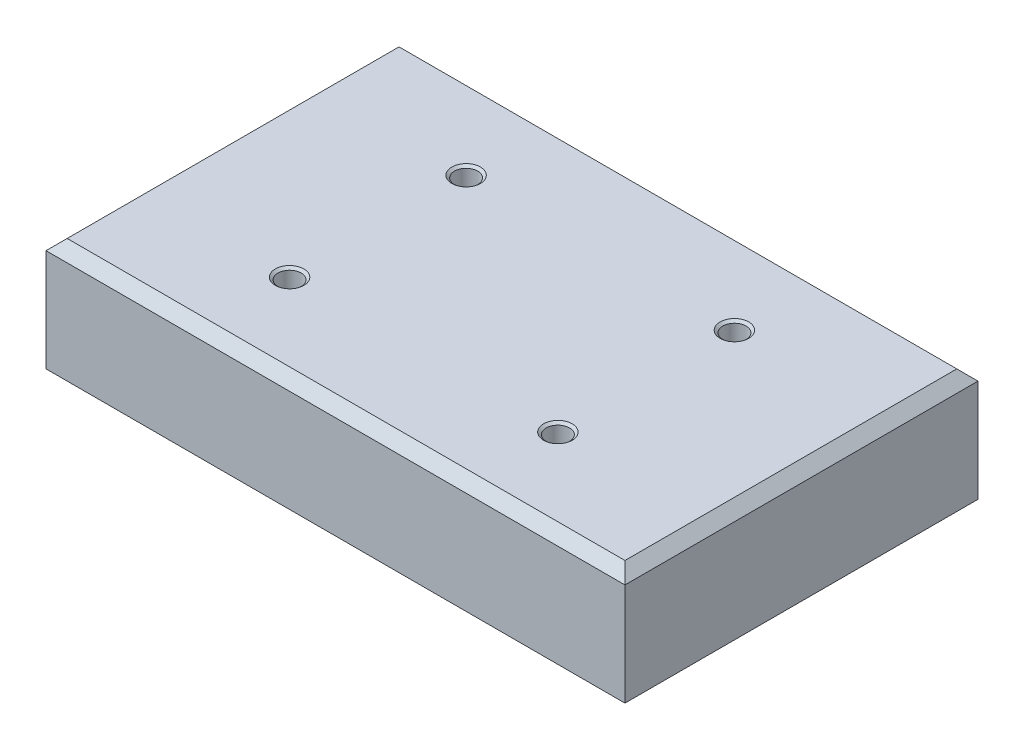
ISO-10303-21;
HEADER;
FILE_DESCRIPTION(('STEP AP214'),'2;1');
FILE_NAME('part.step','',(''),(''),'','','');
FILE_SCHEMA(('AUTOMOTIVE_DESIGN { 1 0 10303 214 1 1 1 1 }'));
ENDSEC;
DATA;
#1=APPLICATION_CONTEXT('core data for automotive mechanical design processes');
#2=APPLICATION_PROTOCOL_DEFINITION('international standard','automotive_design',2000,#1);
#3=PRODUCT_CONTEXT('',#1,'mechanical');
#4=PRODUCT('Part','Part','',(#3));
#5=PRODUCT_RELATED_PRODUCT_CATEGORY('part','',(#4));
#6=PRODUCT_DEFINITION_FORMATION('','',#4);
#7=PRODUCT_DEFINITION_CONTEXT('part definition',#1,'design');
#8=PRODUCT_DEFINITION('design','',#6,#7);
#9=PRODUCT_DEFINITION_SHAPE('','',#8);
#10=(LENGTH_UNIT() NAMED_UNIT(*) SI_UNIT(.MILLI.,.METRE.));
#11=(NAMED_UNIT(*) PLANE_ANGLE_UNIT() SI_UNIT($,.RADIAN.));
#12=(NAMED_UNIT(*) SI_UNIT($,.STERADIAN.) SOLID_ANGLE_UNIT());
#13=UNCERTAINTY_MEASURE_WITH_UNIT(LENGTH_MEASURE(1.E-05),#10,'distance_accuracy_value','');
#14=(GEOMETRIC_REPRESENTATION_CONTEXT(3) GLOBAL_UNCERTAINTY_ASSIGNED_CONTEXT((#13)) GLOBAL_UNIT_ASSIGNED_CONTEXT((#10,
#11,#12)) REPRESENTATION_CONTEXT('',''));
#15=CARTESIAN_POINT('',(0.,0.,0.));
#16=DIRECTION('',(0.,0.,1.));
#17=DIRECTION('',(1.,0.,0.));
#18=AXIS2_PLACEMENT_3D('',#15,#16,#17);
#19=CARTESIAN_POINT('',(41.,16.,-25.));
#20=DIRECTION('',(-1.,0.,0.));
#21=DIRECTION('',(0.,0.,1.));
#22=AXIS2_PLACEMENT_3D('',#19,#20,#21);
#23=PLANE('',#22);
#24=DIRECTION('',(0.,-1.,0.));
#25=VECTOR('',#24,1.);
#26=CARTESIAN_POINT('',(41.,16.,-25.));
#27=LINE('',#26,#25);
#28=CARTESIAN_POINT('',(41.,14.5,-25.));
#29=VERTEX_POINT('',#28);
#30=CARTESIAN_POINT('',(41.,0.,-25.));
#31=VERTEX_POINT('',#30);
#32=EDGE_CURVE('E194',#29,#31,#27,.T.);
#33=ORIENTED_EDGE('',*,*,#32,.F.);
#34=DIRECTION('',(0.,0.,1.));
#35=VECTOR('',#34,1.);
#36=CARTESIAN_POINT('',(41.,14.5,23.5));
#37=LINE('',#36,#35);
#38=CARTESIAN_POINT('',(41.,14.5,25.));
#39=VERTEX_POINT('',#38);
#40=EDGE_CURVE('E218',#29,#39,#37,.T.);
#41=ORIENTED_EDGE('',*,*,#40,.T.);
#42=DIRECTION('',(0.,-1.,0.));
#43=VECTOR('',#42,1.);
#44=CARTESIAN_POINT('',(41.,16.,25.));
#45=LINE('',#44,#43);
#46=CARTESIAN_POINT('',(41.,0.,25.));
#47=VERTEX_POINT('',#46);
#48=EDGE_CURVE('E185',#39,#47,#45,.T.);
#49=ORIENTED_EDGE('',*,*,#48,.T.);
#50=DIRECTION('',(0.,0.,-1.));
#51=VECTOR('',#50,1.);
#52=CARTESIAN_POINT('',(41.,0.,-25.));
#53=LINE('',#52,#51);
#54=EDGE_CURVE('E169',#47,#31,#53,.T.);
#55=ORIENTED_EDGE('',*,*,#54,.T.);
#56=EDGE_LOOP('',(#33,#41,#49,#55));
#57=FACE_BOUND('',#56,.T.);
#58=ADVANCED_FACE('F48',(#57),#23,.F.);
#59=CARTESIAN_POINT('',(-41.,16.,-25.));
#60=DIRECTION('',(0.,0.,1.));
#61=DIRECTION('',(1.,0.,0.));
#62=AXIS2_PLACEMENT_3D('',#59,#60,#61);
#63=PLANE('',#62);
#64=DIRECTION('',(0.,-1.,0.));
#65=VECTOR('',#64,1.);
#66=CARTESIAN_POINT('',(-41.,16.,-25.));
#67=LINE('',#66,#65);
#68=CARTESIAN_POINT('',(-41.,14.5,-25.));
#69=VERTEX_POINT('',#68);
#70=CARTESIAN_POINT('',(-41.,0.,-25.));
#71=VERTEX_POINT('',#70);
#72=EDGE_CURVE('E191',#69,#71,#67,.T.);
#73=ORIENTED_EDGE('',*,*,#72,.F.);
#74=DIRECTION('',(1.,0.,0.));
#75=VECTOR('',#74,1.);
#76=CARTESIAN_POINT('',(39.5,14.5,-25.));
#77=LINE('',#76,#75);
#78=EDGE_CURVE('E58',#69,#29,#77,.T.);
#79=ORIENTED_EDGE('',*,*,#78,.T.);
#80=ORIENTED_EDGE('',*,*,#32,.T.);
#81=DIRECTION('',(-1.,0.,0.));
#82=VECTOR('',#81,1.);
#83=CARTESIAN_POINT('',(-41.,0.,-25.));
#84=LINE('',#83,#82);
#85=EDGE_CURVE('E173',#31,#71,#84,.T.);
#86=ORIENTED_EDGE('',*,*,#85,.T.);
#87=EDGE_LOOP('',(#73,#79,#80,#86));
#88=FACE_BOUND('',#87,.T.);
#89=ADVANCED_FACE('F232',(#88),#63,.F.);
#90=CARTESIAN_POINT('',(-41.,16.,-25.));
#91=DIRECTION('',(1.,0.,0.));
#92=DIRECTION('',(0.,0.,-1.));
#93=AXIS2_PLACEMENT_3D('',#90,#91,#92);
#94=PLANE('',#93);
#95=DIRECTION('',(0.,-1.,0.));
#96=VECTOR('',#95,1.);
#97=CARTESIAN_POINT('',(-41.,16.,25.));
#98=LINE('',#97,#96);
#99=CARTESIAN_POINT('',(-41.,14.5,25.));
#100=VERTEX_POINT('',#99);
#101=CARTESIAN_POINT('',(-41.,0.,25.));
#102=VERTEX_POINT('',#101);
#103=EDGE_CURVE('E188',#100,#102,#98,.T.);
#104=ORIENTED_EDGE('',*,*,#103,.F.);
#105=DIRECTION('',(0.,0.,-1.));
#106=VECTOR('',#105,1.);
#107=CARTESIAN_POINT('',(-41.,14.5,-25.));
#108=LINE('',#107,#106);
#109=EDGE_CURVE('E200',#100,#69,#108,.T.);
#110=ORIENTED_EDGE('',*,*,#109,.T.);
#111=ORIENTED_EDGE('',*,*,#72,.T.);
#112=DIRECTION('',(0.,0.,1.));
#113=VECTOR('',#112,1.);
#114=CARTESIAN_POINT('',(-41.,0.,-25.));
#115=LINE('',#114,#113);
#116=EDGE_CURVE('E177',#71,#102,#115,.T.);
#117=ORIENTED_EDGE('',*,*,#116,.T.);
#118=EDGE_LOOP('',(#104,#110,#111,#117));
#119=FACE_BOUND('',#118,.T.);
#120=ADVANCED_FACE('F254',(#119),#94,.F.);
#121=CARTESIAN_POINT('',(-41.,16.,25.));
#122=DIRECTION('',(0.,0.,-1.));
#123=DIRECTION('',(-1.,0.,0.));
#124=AXIS2_PLACEMENT_3D('',#121,#122,#123);
#125=PLANE('',#124);
#126=ORIENTED_EDGE('',*,*,#48,.F.);
#127=DIRECTION('',(-1.,0.,0.));
#128=VECTOR('',#127,1.);
#129=CARTESIAN_POINT('',(-39.5,14.5,25.));
#130=LINE('',#129,#128);
#131=EDGE_CURVE('E208',#39,#100,#130,.T.);
#132=ORIENTED_EDGE('',*,*,#131,.T.);
#133=ORIENTED_EDGE('',*,*,#103,.T.);
#134=DIRECTION('',(1.,0.,0.));
#135=VECTOR('',#134,1.);
#136=CARTESIAN_POINT('',(-41.,0.,25.));
#137=LINE('',#136,#135);
#138=EDGE_CURVE('E181',#102,#47,#137,.T.);
#139=ORIENTED_EDGE('',*,*,#138,.T.);
#140=EDGE_LOOP('',(#126,#132,#133,#139));
#141=FACE_BOUND('',#140,.T.);
#142=ADVANCED_FACE('F252',(#141),#125,.F.);
#143=CARTESIAN_POINT('',(0.,16.,0.));
#144=DIRECTION('',(0.,1.,0.));
#145=DIRECTION('',(0.,0.,1.));
#146=AXIS2_PLACEMENT_3D('',#143,#144,#145);
#147=PLANE('',#146);
#148=CARTESIAN_POINT('',(-19.,16.,-12.5));
#149=DIRECTION('',(0.,1.,0.));
#150=DIRECTION('',(0.,0.,1.));
#151=AXIS2_PLACEMENT_3D('',#148,#149,#150);
#152=CIRCLE('',#151,2.025);
#153=CARTESIAN_POINT('',(-19.,16.,-10.475));
#154=VERTEX_POINT('',#153);
#155=EDGE_CURVE('E134',#154,#154,#152,.T.);
#156=ORIENTED_EDGE('',*,*,#155,.F.);
#157=EDGE_LOOP('',(#156));
#158=FACE_BOUND('',#157,.T.);
#159=CARTESIAN_POINT('',(19.,16.,-12.5));
#160=DIRECTION('',(0.,1.,0.));
#161=DIRECTION('',(0.,0.,1.));
#162=AXIS2_PLACEMENT_3D('',#159,#160,#161);
#163=CIRCLE('',#162,2.025);
#164=CARTESIAN_POINT('',(19.,16.,-10.475));
#165=VERTEX_POINT('',#164);
#166=EDGE_CURVE('E125',#165,#165,#163,.T.);
#167=ORIENTED_EDGE('',*,*,#166,.F.);
#168=EDGE_LOOP('',(#167));
#169=FACE_BOUND('',#168,.T.);
#170=CARTESIAN_POINT('',(19.,16.,12.5));
#171=DIRECTION('',(0.,1.,0.));
#172=DIRECTION('',(0.,0.,1.));
#173=AXIS2_PLACEMENT_3D('',#170,#171,#172);
#174=CIRCLE('',#173,2.025);
#175=CARTESIAN_POINT('',(19.,16.,14.525));
#176=VERTEX_POINT('',#175);
#177=EDGE_CURVE('E145',#176,#176,#174,.T.);
#178=ORIENTED_EDGE('',*,*,#177,.F.);
#179=EDGE_LOOP('',(#178));
#180=FACE_BOUND('',#179,.T.);
#181=CARTESIAN_POINT('',(-19.,16.,12.5));
#182=DIRECTION('',(0.,1.,0.));
#183=DIRECTION('',(0.,0.,1.));
#184=AXIS2_PLACEMENT_3D('',#181,#182,#183);
#185=CIRCLE('',#184,2.025);
#186=CARTESIAN_POINT('',(-19.,16.,14.525));
#187=VERTEX_POINT('',#186);
#188=EDGE_CURVE('E157',#187,#187,#185,.T.);
#189=ORIENTED_EDGE('',*,*,#188,.F.);
#190=EDGE_LOOP('',(#189));
#191=FACE_BOUND('',#190,.T.);
#192=DIRECTION('',(0.,0.,-1.));
#193=VECTOR('',#192,1.);
#194=CARTESIAN_POINT('',(39.5,16.,-25.));
#195=LINE('',#194,#193);
#196=CARTESIAN_POINT('',(39.5,16.,23.5));
#197=VERTEX_POINT('',#196);
#198=CARTESIAN_POINT('',(39.5,16.,-23.5));
#199=VERTEX_POINT('',#198);
#200=EDGE_CURVE('E215',#197,#199,#195,.T.);
#201=ORIENTED_EDGE('',*,*,#200,.T.);
#202=DIRECTION('',(-1.,0.,0.));
#203=VECTOR('',#202,1.);
#204=CARTESIAN_POINT('',(-39.5,16.,-23.5));
#205=LINE('',#204,#203);
#206=CARTESIAN_POINT('',(-39.5,16.,-23.5));
#207=VERTEX_POINT('',#206);
#208=EDGE_CURVE('E224',#199,#207,#205,.T.);
#209=ORIENTED_EDGE('',*,*,#208,.T.);
#210=DIRECTION('',(0.,0.,1.));
#211=VECTOR('',#210,1.);
#212=CARTESIAN_POINT('',(-39.5,16.,25.));
#213=LINE('',#212,#211);
#214=CARTESIAN_POINT('',(-39.5,16.,23.5));
#215=VERTEX_POINT('',#214);
#216=EDGE_CURVE('E197',#207,#215,#213,.T.);
#217=ORIENTED_EDGE('',*,*,#216,.T.);
#218=DIRECTION('',(1.,0.,0.));
#219=VECTOR('',#218,1.);
#220=CARTESIAN_POINT('',(41.,16.,23.5));
#221=LINE('',#220,#219);
#222=EDGE_CURVE('E204',#215,#197,#221,.T.);
#223=ORIENTED_EDGE('',*,*,#222,.T.);
#224=EDGE_LOOP('',(#201,#209,#217,#223));
#225=FACE_BOUND('',#224,.T.);
#226=ADVANCED_FACE('F241',(#158,#169,#180,#191,#225),#147,.T.);
#227=CARTESIAN_POINT('',(0.,0.,0.));
#228=DIRECTION('',(0.,1.,0.));
#229=DIRECTION('',(0.,0.,1.));
#230=AXIS2_PLACEMENT_3D('',#227,#228,#229);
#231=PLANE('',#230);
#232=ORIENTED_EDGE('',*,*,#54,.F.);
#233=ORIENTED_EDGE('',*,*,#138,.F.);
#234=ORIENTED_EDGE('',*,*,#116,.F.);
#235=ORIENTED_EDGE('',*,*,#85,.F.);
#236=EDGE_LOOP('',(#232,#233,#234,#235));
#237=FACE_BOUND('',#236,.T.);
#238=ADVANCED_FACE('F258',(#237),#231,.F.);
#239=CARTESIAN_POINT('',(-39.5,16.,0.));
#240=DIRECTION('',(-0.70710678118655,0.707106781186545,0.));
#241=DIRECTION('',(0.,0.,-1.));
#242=AXIS2_PLACEMENT_3D('',#239,#240,#241);
#243=PLANE('',#242);
#244=ORIENTED_EDGE('',*,*,#216,.F.);
#245=DIRECTION('',(-0.577350269189625,-0.577350269189629,-0.577350269189623));
#246=VECTOR('',#245,1.);
#247=CARTESIAN_POINT('',(-31.6666666666667,23.8333333333333,-15.6666666666667));
#248=LINE('',#247,#246);
#249=EDGE_CURVE('E65',#207,#69,#248,.T.);
#250=ORIENTED_EDGE('',*,*,#249,.T.);
#251=ORIENTED_EDGE('',*,*,#109,.F.);
#252=DIRECTION('',(0.577350269189625,0.577350269189629,-0.577350269189624));
#253=VECTOR('',#252,1.);
#254=CARTESIAN_POINT('',(-31.6666666666667,23.8333333333333,15.6666666666667));
#255=LINE('',#254,#253);
#256=EDGE_CURVE('E211',#100,#215,#255,.T.);
#257=ORIENTED_EDGE('',*,*,#256,.T.);
#258=EDGE_LOOP('',(#244,#250,#251,#257));
#259=FACE_BOUND('',#258,.T.);
#260=ADVANCED_FACE('F243',(#259),#243,.T.);
#261=CARTESIAN_POINT('',(0.,16.,23.5));
#262=DIRECTION('',(0.,0.707106781186545,0.70710678118655));
#263=DIRECTION('',(-1.,0.,0.));
#264=AXIS2_PLACEMENT_3D('',#261,#262,#263);
#265=PLANE('',#264);
#266=ORIENTED_EDGE('',*,*,#131,.F.);
#267=DIRECTION('',(-0.577350269189627,0.577350269189628,-0.577350269189623));
#268=VECTOR('',#267,1.);
#269=CARTESIAN_POINT('',(26.3333333333333,29.1666666666667,10.3333333333334));
#270=LINE('',#269,#268);
#271=EDGE_CURVE('E221',#39,#197,#270,.T.);
#272=ORIENTED_EDGE('',*,*,#271,.T.);
#273=ORIENTED_EDGE('',*,*,#222,.F.);
#274=ORIENTED_EDGE('',*,*,#256,.F.);
#275=EDGE_LOOP('',(#266,#272,#273,#274));
#276=FACE_BOUND('',#275,.T.);
#277=ADVANCED_FACE('F249',(#276),#265,.T.);
#278=CARTESIAN_POINT('',(39.5,16.,0.));
#279=DIRECTION('',(0.707106781186548,0.707106781186547,0.));
#280=DIRECTION('',(0.,0.,1.));
#281=AXIS2_PLACEMENT_3D('',#278,#279,#280);
#282=PLANE('',#281);
#283=ORIENTED_EDGE('',*,*,#40,.F.);
#284=DIRECTION('',(-0.577350269189627,0.577350269189628,0.577350269189623));
#285=VECTOR('',#284,1.);
#286=CARTESIAN_POINT('',(31.6666666666667,23.8333333333333,-15.6666666666668));
#287=LINE('',#286,#285);
#288=EDGE_CURVE('E11',#29,#199,#287,.T.);
#289=ORIENTED_EDGE('',*,*,#288,.T.);
#290=ORIENTED_EDGE('',*,*,#200,.F.);
#291=ORIENTED_EDGE('',*,*,#271,.F.);
#292=EDGE_LOOP('',(#283,#289,#290,#291));
#293=FACE_BOUND('',#292,.T.);
#294=ADVANCED_FACE('F238',(#293),#282,.T.);
#295=CARTESIAN_POINT('',(0.,16.,-23.5));
#296=DIRECTION('',(0.,0.707106781186544,-0.707106781186551));
#297=DIRECTION('',(1.,0.,0.));
#298=AXIS2_PLACEMENT_3D('',#295,#296,#297);
#299=PLANE('',#298);
#300=ORIENTED_EDGE('',*,*,#288,.F.);
#301=ORIENTED_EDGE('',*,*,#78,.F.);
#302=ORIENTED_EDGE('',*,*,#249,.F.);
#303=ORIENTED_EDGE('',*,*,#208,.F.);
#304=EDGE_LOOP('',(#300,#301,#302,#303));
#305=FACE_BOUND('',#304,.T.);
#306=ADVANCED_FACE('F51',(#305),#299,.T.);
#307=CARTESIAN_POINT('',(-19.,8.,12.5));
#308=DIRECTION('',(0.,1.,0.));
#309=DIRECTION('',(0.,0.,1.));
#310=AXIS2_PLACEMENT_3D('',#307,#308,#309);
#311=CONICAL_SURFACE('',#310,1.65,1.02974425867665);
#312=CARTESIAN_POINT('',(-19.,7.00857997860452,12.5));
#313=VERTEX_POINT('',#312);
#314=VERTEX_LOOP('',#313);
#315=FACE_BOUND('',#314,.T.);
#316=CARTESIAN_POINT('',(-19.,8.,12.5));
#317=DIRECTION('',(0.,1.,0.));
#318=DIRECTION('',(0.,0.,1.));
#319=AXIS2_PLACEMENT_3D('',#316,#317,#318);
#320=CIRCLE('',#319,1.65);
#321=CARTESIAN_POINT('',(-19.,8.,14.15));
#322=VERTEX_POINT('',#321);
#323=EDGE_CURVE('E165',#322,#322,#320,.T.);
#324=ORIENTED_EDGE('',*,*,#323,.T.);
#325=EDGE_LOOP('',(#324));
#326=FACE_BOUND('',#325,.T.);
#327=ADVANCED_FACE('F291',(#315,#326),#311,.F.);
#328=CARTESIAN_POINT('',(-19.,16.,12.5));
#329=DIRECTION('',(0.,1.,0.));
#330=DIRECTION('',(0.,0.,1.));
#331=AXIS2_PLACEMENT_3D('',#328,#329,#330);
#332=CYLINDRICAL_SURFACE('',#331,1.65);
#333=ORIENTED_EDGE('',*,*,#323,.F.);
#334=EDGE_LOOP('',(#333));
#335=FACE_BOUND('',#334,.T.);
#336=CARTESIAN_POINT('',(-19.,15.6853376383085,12.5));
#337=DIRECTION('',(0.,1.,0.));
#338=DIRECTION('',(0.,0.,1.));
#339=AXIS2_PLACEMENT_3D('',#336,#337,#338);
#340=CIRCLE('',#339,1.64999999999999);
#341=CARTESIAN_POINT('',(-19.,15.6853376383085,14.15));
#342=VERTEX_POINT('',#341);
#343=EDGE_CURVE('E161',#342,#342,#340,.T.);
#344=ORIENTED_EDGE('',*,*,#343,.T.);
#345=EDGE_LOOP('',(#344));
#346=FACE_BOUND('',#345,.T.);
#347=ADVANCED_FACE('F295',(#335,#346),#332,.F.);
#348=CARTESIAN_POINT('',(-19.,16.,12.5));
#349=DIRECTION('',(0.,1.,0.));
#350=DIRECTION('',(0.,0.,1.));
#351=AXIS2_PLACEMENT_3D('',#348,#349,#350);
#352=CONICAL_SURFACE('',#351,2.025,0.872664625997176);
#353=ORIENTED_EDGE('',*,*,#343,.F.);
#354=EDGE_LOOP('',(#353));
#355=FACE_BOUND('',#354,.T.);
#356=ORIENTED_EDGE('',*,*,#188,.T.);
#357=EDGE_LOOP('',(#356));
#358=FACE_BOUND('',#357,.T.);
#359=ADVANCED_FACE('F301',(#355,#358),#352,.F.);
#360=CARTESIAN_POINT('',(19.,8.,12.5));
#361=DIRECTION('',(0.,1.,0.));
#362=DIRECTION('',(0.,0.,1.));
#363=AXIS2_PLACEMENT_3D('',#360,#361,#362);
#364=CONICAL_SURFACE('',#363,1.65,1.02974425867665);
#365=CARTESIAN_POINT('',(19.,7.00857997860452,12.5));
#366=VERTEX_POINT('',#365);
#367=VERTEX_LOOP('',#366);
#368=FACE_BOUND('',#367,.T.);
#369=CARTESIAN_POINT('',(19.,8.,12.5));
#370=DIRECTION('',(0.,1.,0.));
#371=DIRECTION('',(0.,0.,1.));
#372=AXIS2_PLACEMENT_3D('',#369,#370,#371);
#373=CIRCLE('',#372,1.65);
#374=CARTESIAN_POINT('',(19.,8.,14.15));
#375=VERTEX_POINT('',#374);
#376=EDGE_CURVE('E153',#375,#375,#373,.T.);
#377=ORIENTED_EDGE('',*,*,#376,.T.);
#378=EDGE_LOOP('',(#377));
#379=FACE_BOUND('',#378,.T.);
#380=ADVANCED_FACE('F308',(#368,#379),#364,.F.);
#381=CARTESIAN_POINT('',(19.,16.,12.5));
#382=DIRECTION('',(0.,1.,0.));
#383=DIRECTION('',(0.,0.,1.));
#384=AXIS2_PLACEMENT_3D('',#381,#382,#383);
#385=CYLINDRICAL_SURFACE('',#384,1.65);
#386=ORIENTED_EDGE('',*,*,#376,.F.);
#387=EDGE_LOOP('',(#386));
#388=FACE_BOUND('',#387,.T.);
#389=CARTESIAN_POINT('',(19.,15.6853376383085,12.5));
#390=DIRECTION('',(0.,1.,0.));
#391=DIRECTION('',(0.,0.,1.));
#392=AXIS2_PLACEMENT_3D('',#389,#390,#391);
#393=CIRCLE('',#392,1.64999999999999);
#394=CARTESIAN_POINT('',(19.,15.6853376383085,14.15));
#395=VERTEX_POINT('',#394);
#396=EDGE_CURVE('E149',#395,#395,#393,.T.);
#397=ORIENTED_EDGE('',*,*,#396,.T.);
#398=EDGE_LOOP('',(#397));
#399=FACE_BOUND('',#398,.T.);
#400=ADVANCED_FACE('F312',(#388,#399),#385,.F.);
#401=CARTESIAN_POINT('',(19.,16.,12.5));
#402=DIRECTION('',(0.,1.,0.));
#403=DIRECTION('',(0.,0.,1.));
#404=AXIS2_PLACEMENT_3D('',#401,#402,#403);
#405=CONICAL_SURFACE('',#404,2.025,0.872664625997176);
#406=ORIENTED_EDGE('',*,*,#396,.F.);
#407=EDGE_LOOP('',(#406));
#408=FACE_BOUND('',#407,.T.);
#409=ORIENTED_EDGE('',*,*,#177,.T.);
#410=EDGE_LOOP('',(#409));
#411=FACE_BOUND('',#410,.T.);
#412=ADVANCED_FACE('F316',(#408,#411),#405,.F.);
#413=CARTESIAN_POINT('',(19.,8.,-12.5));
#414=DIRECTION('',(0.,1.,0.));
#415=DIRECTION('',(0.,0.,1.));
#416=AXIS2_PLACEMENT_3D('',#413,#414,#415);
#417=CONICAL_SURFACE('',#416,1.65,1.02974425867665);
#418=CARTESIAN_POINT('',(19.,7.00857997860452,-12.5));
#419=VERTEX_POINT('',#418);
#420=VERTEX_LOOP('',#419);
#421=FACE_BOUND('',#420,.T.);
#422=CARTESIAN_POINT('',(19.,8.,-12.5));
#423=DIRECTION('',(0.,1.,0.));
#424=DIRECTION('',(0.,0.,1.));
#425=AXIS2_PLACEMENT_3D('',#422,#423,#424);
#426=CIRCLE('',#425,1.65);
#427=CARTESIAN_POINT('',(19.,8.,-10.85));
#428=VERTEX_POINT('',#427);
#429=EDGE_CURVE('E141',#428,#428,#426,.T.);
#430=ORIENTED_EDGE('',*,*,#429,.T.);
#431=EDGE_LOOP('',(#430));
#432=FACE_BOUND('',#431,.T.);
#433=ADVANCED_FACE('F320',(#421,#432),#417,.F.);
#434=CARTESIAN_POINT('',(19.,16.,-12.5));
#435=DIRECTION('',(0.,1.,0.));
#436=DIRECTION('',(0.,0.,1.));
#437=AXIS2_PLACEMENT_3D('',#434,#435,#436);
#438=CYLINDRICAL_SURFACE('',#437,1.64999999999999);
#439=ORIENTED_EDGE('',*,*,#429,.F.);
#440=EDGE_LOOP('',(#439));
#441=FACE_BOUND('',#440,.T.);
#442=CARTESIAN_POINT('',(19.,15.6853376383085,-12.5));
#443=DIRECTION('',(0.,1.,0.));
#444=DIRECTION('',(0.,0.,1.));
#445=AXIS2_PLACEMENT_3D('',#442,#443,#444);
#446=CIRCLE('',#445,1.64999999999999);
#447=CARTESIAN_POINT('',(19.,15.6853376383085,-10.85));
#448=VERTEX_POINT('',#447);
#449=EDGE_CURVE('E131',#448,#448,#446,.T.);
#450=ORIENTED_EDGE('',*,*,#449,.T.);
#451=EDGE_LOOP('',(#450));
#452=FACE_BOUND('',#451,.T.);
#453=ADVANCED_FACE('F324',(#441,#452),#438,.F.);
#454=CARTESIAN_POINT('',(19.,16.,-12.5));
#455=DIRECTION('',(0.,1.,0.));
#456=DIRECTION('',(0.,0.,1.));
#457=AXIS2_PLACEMENT_3D('',#454,#455,#456);
#458=CONICAL_SURFACE('',#457,2.025,0.87266462599718);
#459=ORIENTED_EDGE('',*,*,#449,.F.);
#460=EDGE_LOOP('',(#459));
#461=FACE_BOUND('',#460,.T.);
#462=ORIENTED_EDGE('',*,*,#166,.T.);
#463=EDGE_LOOP('',(#462));
#464=FACE_BOUND('',#463,.T.);
#465=ADVANCED_FACE('F118',(#461,#464),#458,.F.);
#466=CARTESIAN_POINT('',(-19.,8.,-12.5));
#467=DIRECTION('',(0.,1.,0.));
#468=DIRECTION('',(0.,0.,1.));
#469=AXIS2_PLACEMENT_3D('',#466,#467,#468);
#470=CONICAL_SURFACE('',#469,1.65,1.02974425867665);
#471=CARTESIAN_POINT('',(-19.,7.00857997860452,-12.5));
#472=VERTEX_POINT('',#471);
#473=VERTEX_LOOP('',#472);
#474=FACE_BOUND('',#473,.T.);
#475=CARTESIAN_POINT('',(-19.,8.,-12.5));
#476=DIRECTION('',(0.,1.,0.));
#477=DIRECTION('',(0.,0.,1.));
#478=AXIS2_PLACEMENT_3D('',#475,#476,#477);
#479=CIRCLE('',#478,1.65);
#480=CARTESIAN_POINT('',(-19.,8.,-10.85));
#481=VERTEX_POINT('',#480);
#482=EDGE_CURVE('E122',#481,#481,#479,.T.);
#483=ORIENTED_EDGE('',*,*,#482,.T.);
#484=EDGE_LOOP('',(#483));
#485=FACE_BOUND('',#484,.T.);
#486=ADVANCED_FACE('F114',(#474,#485),#470,.F.);
#487=CARTESIAN_POINT('',(-19.,16.,-12.5));
#488=DIRECTION('',(0.,1.,0.));
#489=DIRECTION('',(0.,0.,1.));
#490=AXIS2_PLACEMENT_3D('',#487,#488,#489);
#491=CYLINDRICAL_SURFACE('',#490,1.64999999999999);
#492=ORIENTED_EDGE('',*,*,#482,.F.);
#493=EDGE_LOOP('',(#492));
#494=FACE_BOUND('',#493,.T.);
#495=CARTESIAN_POINT('',(-19.,15.6853376383085,-12.5));
#496=DIRECTION('',(0.,1.,0.));
#497=DIRECTION('',(0.,0.,1.));
#498=AXIS2_PLACEMENT_3D('',#495,#496,#497);
#499=CIRCLE('',#498,1.64999999999999);
#500=CARTESIAN_POINT('',(-19.,15.6853376383085,-10.85));
#501=VERTEX_POINT('',#500);
#502=EDGE_CURVE('E126',#501,#501,#499,.T.);
#503=ORIENTED_EDGE('',*,*,#502,.T.);
#504=EDGE_LOOP('',(#503));
#505=FACE_BOUND('',#504,.T.);
#506=ADVANCED_FACE('F117',(#494,#505),#491,.F.);
#507=CARTESIAN_POINT('',(-19.,16.,-12.5));
#508=DIRECTION('',(0.,1.,0.));
#509=DIRECTION('',(0.,0.,1.));
#510=AXIS2_PLACEMENT_3D('',#507,#508,#509);
#511=CONICAL_SURFACE('',#510,2.025,0.87266462599718);
#512=ORIENTED_EDGE('',*,*,#502,.F.);
#513=EDGE_LOOP('',(#512));
#514=FACE_BOUND('',#513,.T.);
#515=ORIENTED_EDGE('',*,*,#155,.T.);
#516=EDGE_LOOP('',(#515));
#517=FACE_BOUND('',#516,.T.);
#518=ADVANCED_FACE('F334',(#514,#517),#511,.F.);
#519=CLOSED_SHELL('',(#58,#89,#120,#142,#226,#238,#260,#277,#294,#306,#327,#347,#359,#380,#400,
#412,#433,#453,#465,#486,#506,#518));
#520=MANIFOLD_SOLID_BREP('B2',#519);
#521=ADVANCED_BREP_SHAPE_REPRESENTATION('',(#18,#520),#14);
#522=SHAPE_DEFINITION_REPRESENTATION(#9,#521);
ENDSEC;
END-ISO-10303-21;
